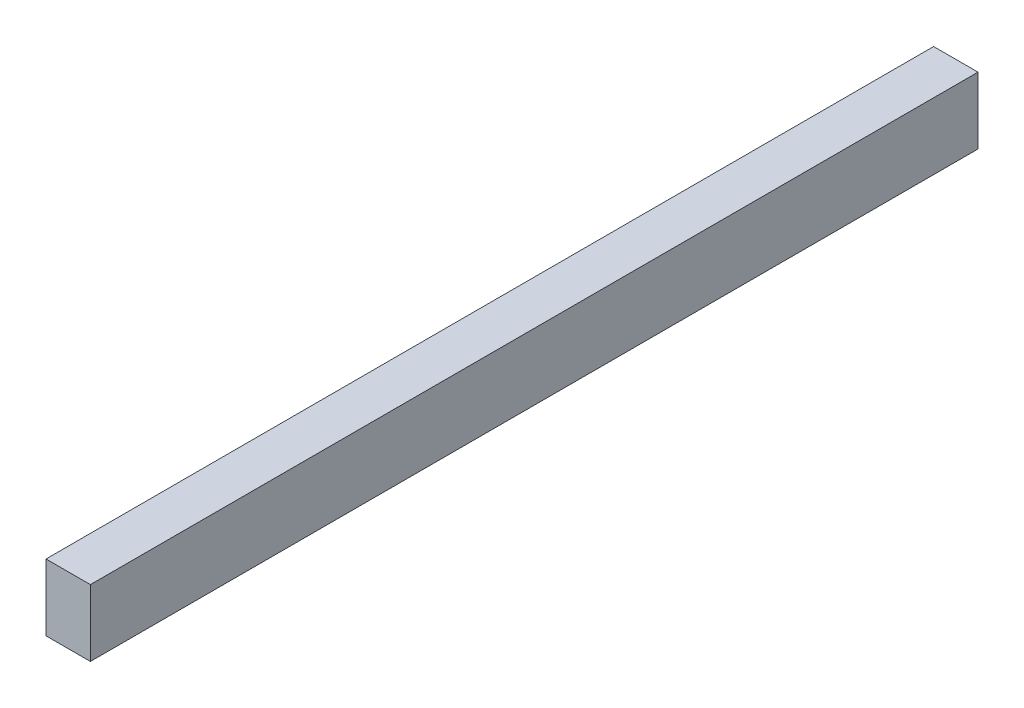
ISO-10303-21;
HEADER;
FILE_DESCRIPTION(('STEP AP214'),'2;1');
FILE_NAME('part.step','',(''),(''),'','','');
FILE_SCHEMA(('AUTOMOTIVE_DESIGN { 1 0 10303 214 1 1 1 1 }'));
ENDSEC;
DATA;
#1=APPLICATION_CONTEXT('core data for automotive mechanical design processes');
#2=APPLICATION_PROTOCOL_DEFINITION('international standard','automotive_design',2000,#1);
#3=PRODUCT_CONTEXT('',#1,'mechanical');
#4=PRODUCT('Part','Part','',(#3));
#5=PRODUCT_RELATED_PRODUCT_CATEGORY('part','',(#4));
#6=PRODUCT_DEFINITION_FORMATION('','',#4);
#7=PRODUCT_DEFINITION_CONTEXT('part definition',#1,'design');
#8=PRODUCT_DEFINITION('design','',#6,#7);
#9=PRODUCT_DEFINITION_SHAPE('','',#8);
#10=(LENGTH_UNIT() NAMED_UNIT(*) SI_UNIT(.MILLI.,.METRE.));
#11=(NAMED_UNIT(*) PLANE_ANGLE_UNIT() SI_UNIT($,.RADIAN.));
#12=(NAMED_UNIT(*) SI_UNIT($,.STERADIAN.) SOLID_ANGLE_UNIT());
#13=UNCERTAINTY_MEASURE_WITH_UNIT(LENGTH_MEASURE(1.E-05),#10,'distance_accuracy_value','');
#14=(GEOMETRIC_REPRESENTATION_CONTEXT(3) GLOBAL_UNCERTAINTY_ASSIGNED_CONTEXT((#13)) GLOBAL_UNIT_ASSIGNED_CONTEXT((#10,
#11,#12)) REPRESENTATION_CONTEXT('',''));
#15=CARTESIAN_POINT('',(0.,0.,0.));
#16=DIRECTION('',(0.,0.,1.));
#17=DIRECTION('',(1.,0.,0.));
#18=AXIS2_PLACEMENT_3D('',#15,#16,#17);
#19=CARTESIAN_POINT('',(0.,0.,200.));
#20=DIRECTION('',(0.,1.,0.));
#21=DIRECTION('',(0.,0.,1.));
#22=AXIS2_PLACEMENT_3D('',#19,#20,#21);
#23=PLANE('',#22);
#24=DIRECTION('',(-1.,0.,0.));
#25=VECTOR('',#24,1.);
#26=CARTESIAN_POINT('',(0.,0.,150.));
#27=LINE('',#26,#25);
#28=CARTESIAN_POINT('',(10.,0.,150.));
#29=VERTEX_POINT('',#28);
#30=CARTESIAN_POINT('',(0.,0.,150.));
#31=VERTEX_POINT('',#30);
#32=EDGE_CURVE('E12',#29,#31,#27,.T.);
#33=ORIENTED_EDGE('',*,*,#32,.F.);
#34=DIRECTION('',(0.,0.,-1.));
#35=VECTOR('',#34,1.);
#36=CARTESIAN_POINT('',(10.,0.,200.));
#37=LINE('',#36,#35);
#38=CARTESIAN_POINT('',(10.,0.,200.));
#39=VERTEX_POINT('',#38);
#40=EDGE_CURVE('E107',#39,#29,#37,.T.);
#41=ORIENTED_EDGE('',*,*,#40,.F.);
#42=DIRECTION('',(1.,0.,0.));
#43=VECTOR('',#42,1.);
#44=CARTESIAN_POINT('',(0.,0.,200.));
#45=LINE('',#44,#43);
#46=CARTESIAN_POINT('',(0.,0.,200.));
#47=VERTEX_POINT('',#46);
#48=EDGE_CURVE('E103',#47,#39,#45,.T.);
#49=ORIENTED_EDGE('',*,*,#48,.F.);
#50=DIRECTION('',(0.,0.,-1.));
#51=VECTOR('',#50,1.);
#52=CARTESIAN_POINT('',(0.,0.,200.));
#53=LINE('',#52,#51);
#54=EDGE_CURVE('E62',#47,#31,#53,.T.);
#55=ORIENTED_EDGE('',*,*,#54,.T.);
#56=EDGE_LOOP('',(#33,#41,#49,#55));
#57=FACE_BOUND('',#56,.T.);
#58=ADVANCED_FACE('F53',(#57),#23,.F.);
#59=CARTESIAN_POINT('',(0.,0.,200.));
#60=DIRECTION('',(1.,0.,0.));
#61=DIRECTION('',(0.,0.,-1.));
#62=AXIS2_PLACEMENT_3D('',#59,#60,#61);
#63=PLANE('',#62);
#64=DIRECTION('',(0.,-1.,0.));
#65=VECTOR('',#64,1.);
#66=CARTESIAN_POINT('',(0.,0.,0.));
#67=LINE('',#66,#65);
#68=CARTESIAN_POINT('',(0.,15.,0.));
#69=VERTEX_POINT('',#68);
#70=CARTESIAN_POINT('',(0.,0.,0.));
#71=VERTEX_POINT('',#70);
#72=EDGE_CURVE('E139',#69,#71,#67,.T.);
#73=ORIENTED_EDGE('',*,*,#72,.T.);
#74=EDGE_CURVE('E123',#31,#71,#53,.T.);
#75=ORIENTED_EDGE('',*,*,#74,.F.);
#76=ORIENTED_EDGE('',*,*,#54,.F.);
#77=DIRECTION('',(0.,-1.,0.));
#78=VECTOR('',#77,1.);
#79=CARTESIAN_POINT('',(0.,0.,200.));
#80=LINE('',#79,#78);
#81=CARTESIAN_POINT('',(0.,15.,200.));
#82=VERTEX_POINT('',#81);
#83=EDGE_CURVE('E111',#82,#47,#80,.T.);
#84=ORIENTED_EDGE('',*,*,#83,.F.);
#85=DIRECTION('',(0.,0.,-1.));
#86=VECTOR('',#85,1.);
#87=CARTESIAN_POINT('',(0.,15.,200.));
#88=LINE('',#87,#86);
#89=EDGE_CURVE('E159',#82,#69,#88,.T.);
#90=ORIENTED_EDGE('',*,*,#89,.T.);
#91=EDGE_LOOP('',(#73,#75,#76,#84,#90));
#92=FACE_BOUND('',#91,.T.);
#93=ADVANCED_FACE('F55',(#92),#63,.F.);
#94=CARTESIAN_POINT('',(10.,0.,0.));
#95=VERTEX_POINT('',#94);
#96=EDGE_CURVE('E127',#29,#95,#37,.T.);
#97=ORIENTED_EDGE('',*,*,#96,.F.);
#98=ORIENTED_EDGE('',*,*,#32,.T.);
#99=ORIENTED_EDGE('',*,*,#74,.T.);
#100=DIRECTION('',(1.,0.,0.));
#101=VECTOR('',#100,1.);
#102=CARTESIAN_POINT('',(0.,0.,0.));
#103=LINE('',#102,#101);
#104=EDGE_CURVE('E143',#71,#95,#103,.T.);
#105=ORIENTED_EDGE('',*,*,#104,.T.);
#106=EDGE_LOOP('',(#97,#98,#99,#105));
#107=FACE_BOUND('',#106,.T.);
#108=ADVANCED_FACE('F176',(#107),#23,.F.);
#109=CARTESIAN_POINT('',(10.,0.,200.));
#110=DIRECTION('',(-1.,0.,0.));
#111=DIRECTION('',(0.,0.,1.));
#112=AXIS2_PLACEMENT_3D('',#109,#110,#111);
#113=PLANE('',#112);
#114=DIRECTION('',(0.,1.,0.));
#115=VECTOR('',#114,1.);
#116=CARTESIAN_POINT('',(10.,0.,0.));
#117=LINE('',#116,#115);
#118=CARTESIAN_POINT('',(10.,15.,0.));
#119=VERTEX_POINT('',#118);
#120=EDGE_CURVE('E150',#95,#119,#117,.T.);
#121=ORIENTED_EDGE('',*,*,#120,.T.);
#122=DIRECTION('',(0.,0.,-1.));
#123=VECTOR('',#122,1.);
#124=CARTESIAN_POINT('',(10.,15.,200.));
#125=LINE('',#124,#123);
#126=CARTESIAN_POINT('',(10.,15.,200.));
#127=VERTEX_POINT('',#126);
#128=EDGE_CURVE('E128',#127,#119,#125,.T.);
#129=ORIENTED_EDGE('',*,*,#128,.F.);
#130=DIRECTION('',(0.,1.,0.));
#131=VECTOR('',#130,1.);
#132=CARTESIAN_POINT('',(10.,0.,200.));
#133=LINE('',#132,#131);
#134=EDGE_CURVE('E110',#39,#127,#133,.T.);
#135=ORIENTED_EDGE('',*,*,#134,.F.);
#136=ORIENTED_EDGE('',*,*,#40,.T.);
#137=ORIENTED_EDGE('',*,*,#96,.T.);
#138=EDGE_LOOP('',(#121,#129,#135,#136,#137));
#139=FACE_BOUND('',#138,.T.);
#140=ADVANCED_FACE('F166',(#139),#113,.F.);
#141=CARTESIAN_POINT('',(0.,15.,200.));
#142=DIRECTION('',(0.,-1.,0.));
#143=DIRECTION('',(0.,0.,-1.));
#144=AXIS2_PLACEMENT_3D('',#141,#142,#143);
#145=PLANE('',#144);
#146=DIRECTION('',(-1.,0.,0.));
#147=VECTOR('',#146,1.);
#148=CARTESIAN_POINT('',(0.,15.,0.));
#149=LINE('',#148,#147);
#150=EDGE_CURVE('E120',#119,#69,#149,.T.);
#151=ORIENTED_EDGE('',*,*,#150,.T.);
#152=ORIENTED_EDGE('',*,*,#89,.F.);
#153=DIRECTION('',(-1.,0.,0.));
#154=VECTOR('',#153,1.);
#155=CARTESIAN_POINT('',(0.,15.,200.));
#156=LINE('',#155,#154);
#157=EDGE_CURVE('E116',#127,#82,#156,.T.);
#158=ORIENTED_EDGE('',*,*,#157,.F.);
#159=ORIENTED_EDGE('',*,*,#128,.T.);
#160=EDGE_LOOP('',(#151,#152,#158,#159));
#161=FACE_BOUND('',#160,.T.);
#162=ADVANCED_FACE('F170',(#161),#145,.F.);
#163=CARTESIAN_POINT('',(0.,0.,200.));
#164=DIRECTION('',(0.,0.,-1.));
#165=DIRECTION('',(-1.,0.,0.));
#166=AXIS2_PLACEMENT_3D('',#163,#164,#165);
#167=PLANE('',#166);
#168=ORIENTED_EDGE('',*,*,#83,.T.);
#169=ORIENTED_EDGE('',*,*,#48,.T.);
#170=ORIENTED_EDGE('',*,*,#134,.T.);
#171=ORIENTED_EDGE('',*,*,#157,.T.);
#172=EDGE_LOOP('',(#168,#169,#170,#171));
#173=FACE_BOUND('',#172,.T.);
#174=ADVANCED_FACE('F114',(#173),#167,.F.);
#175=CARTESIAN_POINT('',(0.,0.,0.));
#176=DIRECTION('',(0.,0.,-1.));
#177=DIRECTION('',(-1.,0.,0.));
#178=AXIS2_PLACEMENT_3D('',#175,#176,#177);
#179=PLANE('',#178);
#180=ORIENTED_EDGE('',*,*,#72,.F.);
#181=ORIENTED_EDGE('',*,*,#150,.F.);
#182=ORIENTED_EDGE('',*,*,#120,.F.);
#183=ORIENTED_EDGE('',*,*,#104,.F.);
#184=EDGE_LOOP('',(#180,#181,#182,#183));
#185=FACE_BOUND('',#184,.T.);
#186=ADVANCED_FACE('F172',(#185),#179,.T.);
#187=CLOSED_SHELL('',(#58,#93,#108,#140,#162,#174,#186));
#188=MANIFOLD_SOLID_BREP('B2',#187);
#189=ADVANCED_BREP_SHAPE_REPRESENTATION('',(#18,#188),#14);
#190=SHAPE_DEFINITION_REPRESENTATION(#9,#189);
ENDSEC;
END-ISO-10303-21;
